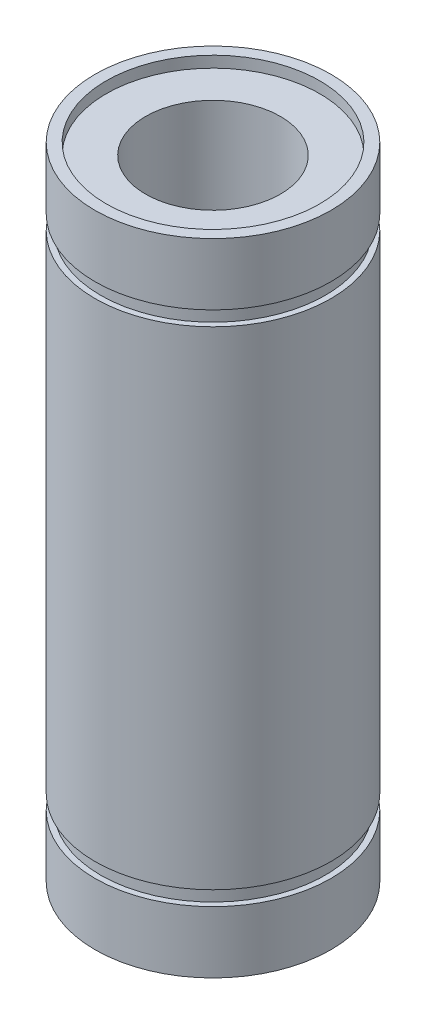
ISO-10303-21;
HEADER;
FILE_DESCRIPTION(('STEP AP214'),'2;1');
FILE_NAME('part.step','',(''),(''),'','','');
FILE_SCHEMA(('AUTOMOTIVE_DESIGN { 1 0 10303 214 1 1 1 1 }'));
ENDSEC;
DATA;
#1=APPLICATION_CONTEXT('core data for automotive mechanical design processes');
#2=APPLICATION_PROTOCOL_DEFINITION('international standard','automotive_design',2000,#1);
#3=PRODUCT_CONTEXT('',#1,'mechanical');
#4=PRODUCT('Part','Part','',(#3));
#5=PRODUCT_RELATED_PRODUCT_CATEGORY('part','',(#4));
#6=PRODUCT_DEFINITION_FORMATION('','',#4);
#7=PRODUCT_DEFINITION_CONTEXT('part definition',#1,'design');
#8=PRODUCT_DEFINITION('design','',#6,#7);
#9=PRODUCT_DEFINITION_SHAPE('','',#8);
#10=(LENGTH_UNIT() NAMED_UNIT(*) SI_UNIT(.MILLI.,.METRE.));
#11=(NAMED_UNIT(*) PLANE_ANGLE_UNIT() SI_UNIT($,.RADIAN.));
#12=(NAMED_UNIT(*) SI_UNIT($,.STERADIAN.) SOLID_ANGLE_UNIT());
#13=UNCERTAINTY_MEASURE_WITH_UNIT(LENGTH_MEASURE(1.E-05),#10,'distance_accuracy_value','');
#14=(GEOMETRIC_REPRESENTATION_CONTEXT(3) GLOBAL_UNCERTAINTY_ASSIGNED_CONTEXT((#13)) GLOBAL_UNIT_ASSIGNED_CONTEXT((#10,
#11,#12)) REPRESENTATION_CONTEXT('',''));
#15=CARTESIAN_POINT('',(0.,0.,0.));
#16=DIRECTION('',(0.,0.,1.));
#17=DIRECTION('',(1.,0.,0.));
#18=AXIS2_PLACEMENT_3D('',#15,#16,#17);
#19=CARTESIAN_POINT('',(0.,57.,0.));
#20=DIRECTION('',(0.,-1.,0.));
#21=DIRECTION('',(0.,0.,-1.));
#22=AXIS2_PLACEMENT_3D('',#19,#20,#21);
#23=CYLINDRICAL_SURFACE('',#22,10.5);
#24=CARTESIAN_POINT('',(0.,50.2,0.));
#25=DIRECTION('',(0.,1.,0.));
#26=DIRECTION('',(0.,0.,1.));
#27=AXIS2_PLACEMENT_3D('',#24,#25,#26);
#28=CIRCLE('',#27,10.5);
#29=CARTESIAN_POINT('',(0.,50.2,-10.5));
#30=VERTEX_POINT('',#29);
#31=EDGE_CURVE('E74',#30,#30,#28,.T.);
#32=CARTESIAN_POINT('',(0.,6.8,0.));
#33=DIRECTION('',(0.,-1.,0.));
#34=DIRECTION('',(0.,0.,-1.));
#35=AXIS2_PLACEMENT_3D('',#32,#33,#34);
#36=CIRCLE('',#35,10.5);
#37=CARTESIAN_POINT('',(0.,6.8,-10.5));
#38=VERTEX_POINT('',#37);
#39=EDGE_CURVE('E49',#38,#38,#36,.T.);
#40=CARTESIAN_POINT('',(0.,50.2,-10.5));
#41=CARTESIAN_POINT('',(0.,49.7479166666667,-10.5));
#42=CARTESIAN_POINT('',(0.,49.2958333333333,-10.5));
#43=CARTESIAN_POINT('',(0.,48.3916666666667,-10.5));
#44=CARTESIAN_POINT('',(0.,47.9395833333333,-10.5));
#45=CARTESIAN_POINT('',(0.,47.0354166666667,-10.5));
#46=CARTESIAN_POINT('',(0.,46.5833333333333,-10.5));
#47=CARTESIAN_POINT('',(0.,45.6791666666667,-10.5));
#48=CARTESIAN_POINT('',(0.,45.2270833333333,-10.5));
#49=CARTESIAN_POINT('',(0.,44.3229166666667,-10.5));
#50=CARTESIAN_POINT('',(0.,43.8708333333333,-10.5));
#51=CARTESIAN_POINT('',(0.,42.9666666666667,-10.5));
#52=CARTESIAN_POINT('',(0.,42.5145833333333,-10.5));
#53=CARTESIAN_POINT('',(0.,41.6104166666667,-10.5));
#54=CARTESIAN_POINT('',(0.,41.1583333333333,-10.5));
#55=CARTESIAN_POINT('',(0.,40.2541666666667,-10.5));
#56=CARTESIAN_POINT('',(0.,39.8020833333333,-10.5));
#57=CARTESIAN_POINT('',(0.,38.8979166666667,-10.5));
#58=CARTESIAN_POINT('',(0.,38.4458333333333,-10.5));
#59=CARTESIAN_POINT('',(0.,37.5416666666667,-10.5));
#60=CARTESIAN_POINT('',(0.,37.0895833333333,-10.5));
#61=CARTESIAN_POINT('',(0.,36.1854166666667,-10.5));
#62=CARTESIAN_POINT('',(0.,35.7333333333333,-10.5));
#63=CARTESIAN_POINT('',(0.,34.8291666666667,-10.5));
#64=CARTESIAN_POINT('',(0.,34.3770833333333,-10.5));
#65=CARTESIAN_POINT('',(0.,33.4729166666667,-10.5));
#66=CARTESIAN_POINT('',(0.,33.0208333333333,-10.5));
#67=CARTESIAN_POINT('',(0.,32.1166666666667,-10.5));
#68=CARTESIAN_POINT('',(0.,31.6645833333333,-10.5));
#69=CARTESIAN_POINT('',(0.,30.7604166666667,-10.5));
#70=CARTESIAN_POINT('',(0.,30.3083333333333,-10.5));
#71=CARTESIAN_POINT('',(0.,29.4041666666667,-10.5));
#72=CARTESIAN_POINT('',(0.,28.9520833333333,-10.5));
#73=CARTESIAN_POINT('',(0.,28.0479166666667,-10.5));
#74=CARTESIAN_POINT('',(0.,27.5958333333333,-10.5));
#75=CARTESIAN_POINT('',(0.,26.6916666666667,-10.5));
#76=CARTESIAN_POINT('',(0.,26.2395833333333,-10.5));
#77=CARTESIAN_POINT('',(0.,25.3354166666667,-10.5));
#78=CARTESIAN_POINT('',(0.,24.8833333333333,-10.5));
#79=CARTESIAN_POINT('',(0.,23.9791666666667,-10.5));
#80=CARTESIAN_POINT('',(0.,23.5270833333333,-10.5));
#81=CARTESIAN_POINT('',(0.,22.6229166666667,-10.5));
#82=CARTESIAN_POINT('',(0.,22.1708333333333,-10.5));
#83=CARTESIAN_POINT('',(0.,21.2666666666667,-10.5));
#84=CARTESIAN_POINT('',(0.,20.8145833333333,-10.5));
#85=CARTESIAN_POINT('',(0.,19.9104166666667,-10.5));
#86=CARTESIAN_POINT('',(0.,19.4583333333333,-10.5));
#87=CARTESIAN_POINT('',(0.,18.5541666666667,-10.5));
#88=CARTESIAN_POINT('',(0.,18.1020833333333,-10.5));
#89=CARTESIAN_POINT('',(0.,17.1979166666667,-10.5));
#90=CARTESIAN_POINT('',(0.,16.7458333333333,-10.5));
#91=CARTESIAN_POINT('',(0.,15.8416666666667,-10.5));
#92=CARTESIAN_POINT('',(0.,15.3895833333333,-10.5));
#93=CARTESIAN_POINT('',(0.,14.4854166666667,-10.5));
#94=CARTESIAN_POINT('',(0.,14.0333333333333,-10.5));
#95=CARTESIAN_POINT('',(0.,13.1291666666667,-10.5));
#96=CARTESIAN_POINT('',(0.,12.6770833333333,-10.5));
#97=CARTESIAN_POINT('',(0.,11.7729166666667,-10.5));
#98=CARTESIAN_POINT('',(0.,11.3208333333333,-10.5));
#99=CARTESIAN_POINT('',(0.,10.4166666666667,-10.5));
#100=CARTESIAN_POINT('',(0.,9.96458333333333,-10.5));
#101=CARTESIAN_POINT('',(0.,9.06041666666666,-10.5));
#102=CARTESIAN_POINT('',(0.,8.60833333333333,-10.5));
#103=CARTESIAN_POINT('',(0.,7.70416666666667,-10.5));
#104=CARTESIAN_POINT('',(0.,7.25208333333333,-10.5));
#105=CARTESIAN_POINT('',(0.,6.8,-10.5));
#106=B_SPLINE_CURVE_WITH_KNOTS('',3,(#40,#41,#42,#43,#44,#45,#46,#47,#48,#49,#50,#51,#52,#53,
#54,#55,#56,#57,#58,#59,#60,#61,#62,#63,#64,#65,#66,#67,#68,#69,#70,#71,#72,#73,#74,#75,#76,#77,
#78,#79,#80,#81,#82,#83,#84,#85,#86,#87,#88,#89,#90,#91,#92,#93,#94,#95,#96,#97,#98,#99,#100,
#101,#102,#103,#104,#105),.UNSPECIFIED.,.F.,.F.,(4,2,2,2,2,2,2,2,2,2,2,2,2,2,2,2,2,2,2,2,2,2,2,
2,2,2,2,2,2,2,2,2,4),(0.,1.35625,2.7125,4.06875,5.42500000000001,6.78125,8.13750000000001,
9.49375,10.85,12.20625,13.5625,14.91875,16.275,17.63125,18.9875,20.34375,21.7,23.05625,24.4125,
25.76875,27.125,28.48125,29.8375,31.19375,32.55,33.90625,35.2625,36.61875,37.975,39.33125,
40.6875,42.04375,43.4),.UNSPECIFIED.);
#107=EDGE_CURVE('BSEAM45',#30,#38,#106,.T.);
#108=ORIENTED_EDGE('',*,*,#31,.F.);
#109=ORIENTED_EDGE('',*,*,#39,.F.);
#110=ORIENTED_EDGE('',*,*,#107,.T.);
#111=ORIENTED_EDGE('',*,*,#107,.F.);
#112=EDGE_LOOP('',(#108,#110,#109,#111));
#113=FACE_BOUND('',#112,.T.);
#114=ADVANCED_FACE('F45',(#113),#23,.T.);
#115=CARTESIAN_POINT('',(0.,5.5,0.));
#116=DIRECTION('',(0.,-1.,0.));
#117=DIRECTION('',(0.,0.,-1.));
#118=AXIS2_PLACEMENT_3D('',#115,#116,#117);
#119=CIRCLE('',#118,10.5);
#120=CARTESIAN_POINT('',(0.,5.50000000000001,-10.5));
#121=VERTEX_POINT('',#120);
#122=EDGE_CURVE('E78',#121,#121,#119,.T.);
#123=CARTESIAN_POINT('',(0.,0.,0.));
#124=DIRECTION('',(0.,1.,0.));
#125=DIRECTION('',(0.,0.,1.));
#126=AXIS2_PLACEMENT_3D('',#123,#124,#125);
#127=CIRCLE('',#126,10.5);
#128=CARTESIAN_POINT('',(0.,0.,-10.5));
#129=VERTEX_POINT('',#128);
#130=EDGE_CURVE('E53',#129,#129,#127,.T.);
#131=CARTESIAN_POINT('',(0.,5.50000000000001,-10.5));
#132=CARTESIAN_POINT('',(0.,5.44270833333334,-10.5));
#133=CARTESIAN_POINT('',(0.,5.38541666666667,-10.5));
#134=CARTESIAN_POINT('',(0.,5.27083333333334,-10.5));
#135=CARTESIAN_POINT('',(0.,5.21354166666667,-10.5));
#136=CARTESIAN_POINT('',(0.,5.09895833333334,-10.5));
#137=CARTESIAN_POINT('',(0.,5.04166666666667,-10.5));
#138=CARTESIAN_POINT('',(0.,4.92708333333334,-10.5));
#139=CARTESIAN_POINT('',(0.,4.86979166666667,-10.5));
#140=CARTESIAN_POINT('',(0.,4.75520833333334,-10.5));
#141=CARTESIAN_POINT('',(0.,4.69791666666667,-10.5));
#142=CARTESIAN_POINT('',(0.,4.58333333333334,-10.5));
#143=CARTESIAN_POINT('',(0.,4.52604166666667,-10.5));
#144=CARTESIAN_POINT('',(0.,4.41145833333334,-10.5));
#145=CARTESIAN_POINT('',(0.,4.35416666666667,-10.5));
#146=CARTESIAN_POINT('',(0.,4.23958333333334,-10.5));
#147=CARTESIAN_POINT('',(0.,4.18229166666667,-10.5));
#148=CARTESIAN_POINT('',(0.,4.06770833333334,-10.5));
#149=CARTESIAN_POINT('',(0.,4.01041666666667,-10.5));
#150=CARTESIAN_POINT('',(0.,3.89583333333333,-10.5));
#151=CARTESIAN_POINT('',(0.,3.83854166666667,-10.5));
#152=CARTESIAN_POINT('',(0.,3.72395833333333,-10.5));
#153=CARTESIAN_POINT('',(0.,3.66666666666667,-10.5));
#154=CARTESIAN_POINT('',(0.,3.55208333333334,-10.5));
#155=CARTESIAN_POINT('',(0.,3.49479166666667,-10.5));
#156=CARTESIAN_POINT('',(0.,3.38020833333334,-10.5));
#157=CARTESIAN_POINT('',(0.,3.32291666666667,-10.5));
#158=CARTESIAN_POINT('',(0.,3.20833333333334,-10.5));
#159=CARTESIAN_POINT('',(0.,3.15104166666667,-10.5));
#160=CARTESIAN_POINT('',(0.,3.03645833333334,-10.5));
#161=CARTESIAN_POINT('',(0.,2.97916666666667,-10.5));
#162=CARTESIAN_POINT('',(0.,2.86458333333334,-10.5));
#163=CARTESIAN_POINT('',(0.,2.80729166666667,-10.5));
#164=CARTESIAN_POINT('',(0.,2.69270833333334,-10.5));
#165=CARTESIAN_POINT('',(0.,2.63541666666667,-10.5));
#166=CARTESIAN_POINT('',(0.,2.52083333333333,-10.5));
#167=CARTESIAN_POINT('',(0.,2.46354166666667,-10.5));
#168=CARTESIAN_POINT('',(0.,2.34895833333333,-10.5));
#169=CARTESIAN_POINT('',(0.,2.29166666666667,-10.5));
#170=CARTESIAN_POINT('',(0.,2.17708333333334,-10.5));
#171=CARTESIAN_POINT('',(0.,2.11979166666667,-10.5));
#172=CARTESIAN_POINT('',(0.,2.00520833333333,-10.5));
#173=CARTESIAN_POINT('',(0.,1.94791666666667,-10.5));
#174=CARTESIAN_POINT('',(0.,1.83333333333334,-10.5));
#175=CARTESIAN_POINT('',(0.,1.77604166666667,-10.5));
#176=CARTESIAN_POINT('',(0.,1.66145833333334,-10.5));
#177=CARTESIAN_POINT('',(0.,1.60416666666667,-10.5));
#178=CARTESIAN_POINT('',(0.,1.48958333333334,-10.5));
#179=CARTESIAN_POINT('',(0.,1.43229166666667,-10.5));
#180=CARTESIAN_POINT('',(0.,1.31770833333333,-10.5));
#181=CARTESIAN_POINT('',(0.,1.26041666666667,-10.5));
#182=CARTESIAN_POINT('',(0.,1.14583333333333,-10.5));
#183=CARTESIAN_POINT('',(0.,1.08854166666666,-10.5));
#184=CARTESIAN_POINT('',(0.,0.973958333333332,-10.5));
#185=CARTESIAN_POINT('',(0.,0.916666666666668,-10.5));
#186=CARTESIAN_POINT('',(0.,0.802083333333335,-10.5));
#187=CARTESIAN_POINT('',(0.,0.744791666666668,-10.5));
#188=CARTESIAN_POINT('',(0.,0.630208333333333,-10.5));
#189=CARTESIAN_POINT('',(0.,0.572916666666666,-10.5));
#190=CARTESIAN_POINT('',(0.,0.458333333333334,-10.5));
#191=CARTESIAN_POINT('',(0.,0.401041666666669,-10.5));
#192=CARTESIAN_POINT('',(0.,0.286458333333336,-10.5));
#193=CARTESIAN_POINT('',(0.,0.229166666666669,-10.5));
#194=CARTESIAN_POINT('',(0.,0.114583333333335,-10.5));
#195=CARTESIAN_POINT('',(0.,0.0572916666666673,-10.5));
#196=CARTESIAN_POINT('',(0.,0.,-10.5));
#197=B_SPLINE_CURVE_WITH_KNOTS('',3,(#131,#132,#133,#134,#135,#136,#137,#138,#139,#140,#141,
#142,#143,#144,#145,#146,#147,#148,#149,#150,#151,#152,#153,#154,#155,#156,#157,#158,#159,#160,
#161,#162,#163,#164,#165,#166,#167,#168,#169,#170,#171,#172,#173,#174,#175,#176,#177,#178,#179,
#180,#181,#182,#183,#184,#185,#186,#187,#188,#189,#190,#191,#192,#193,#194,#195,#196),
.UNSPECIFIED.,.F.,.F.,(4,2,2,2,2,2,2,2,2,2,2,2,2,2,2,2,2,2,2,2,2,2,2,2,2,2,2,2,2,2,2,2,4),(0.,
0.171875000000002,0.343750000000004,0.515624999999999,0.687500000000001,0.859375000000002,
1.03125,1.203125,1.375,1.546875,1.71875,1.890625,2.0625,2.234375,2.40625,2.578125,2.75,2.921875,
3.09375000000001,3.265625,3.4375,3.609375,3.78125,3.953125,4.125,4.29687500000001,
4.46875000000001,4.640625,4.8125,4.98437500000001,5.15625,5.328125,5.50000000000001),.UNSPECIFIED.);
#198=EDGE_CURVE('BSEAM119',#121,#129,#197,.T.);
#199=ORIENTED_EDGE('',*,*,#122,.T.);
#200=ORIENTED_EDGE('',*,*,#130,.T.);
#201=ORIENTED_EDGE('',*,*,#198,.T.);
#202=ORIENTED_EDGE('',*,*,#198,.F.);
#203=EDGE_LOOP('',(#199,#201,#200,#202));
#204=FACE_BOUND('',#203,.T.);
#205=ADVANCED_FACE('F119',(#204),#23,.T.);
#206=CARTESIAN_POINT('',(0.,57.,0.));
#207=DIRECTION('',(0.,-1.,0.));
#208=DIRECTION('',(0.,0.,-1.));
#209=AXIS2_PLACEMENT_3D('',#206,#207,#208);
#210=CYLINDRICAL_SURFACE('',#209,6.);
#211=CARTESIAN_POINT('',(0.,56.,0.));
#212=DIRECTION('',(0.,1.,0.));
#213=DIRECTION('',(0.,0.,1.));
#214=AXIS2_PLACEMENT_3D('',#211,#212,#213);
#215=CIRCLE('',#214,6.);
#216=CARTESIAN_POINT('',(0.,56.,-6.));
#217=VERTEX_POINT('',#216);
#218=EDGE_CURVE('E58',#217,#217,#215,.T.);
#219=CARTESIAN_POINT('',(0.,1.,0.));
#220=DIRECTION('',(0.,-1.,0.));
#221=DIRECTION('',(0.,0.,-1.));
#222=AXIS2_PLACEMENT_3D('',#219,#220,#221);
#223=CIRCLE('',#222,6.);
#224=CARTESIAN_POINT('',(0.,1.,-6.));
#225=VERTEX_POINT('',#224);
#226=EDGE_CURVE('E67',#225,#225,#223,.T.);
#227=CARTESIAN_POINT('',(0.,56.,-6.));
#228=CARTESIAN_POINT('',(0.,55.4270833333333,-6.));
#229=CARTESIAN_POINT('',(0.,54.8541666666667,-6.));
#230=CARTESIAN_POINT('',(0.,53.7083333333333,-6.));
#231=CARTESIAN_POINT('',(0.,53.1354166666667,-6.));
#232=CARTESIAN_POINT('',(0.,51.9895833333333,-6.));
#233=CARTESIAN_POINT('',(0.,51.4166666666667,-6.));
#234=CARTESIAN_POINT('',(0.,50.2708333333333,-6.));
#235=CARTESIAN_POINT('',(0.,49.6979166666667,-6.));
#236=CARTESIAN_POINT('',(0.,48.5520833333333,-6.));
#237=CARTESIAN_POINT('',(0.,47.9791666666667,-6.));
#238=CARTESIAN_POINT('',(0.,46.8333333333333,-6.));
#239=CARTESIAN_POINT('',(0.,46.2604166666667,-6.));
#240=CARTESIAN_POINT('',(0.,45.1145833333333,-6.));
#241=CARTESIAN_POINT('',(0.,44.5416666666667,-6.));
#242=CARTESIAN_POINT('',(0.,43.3958333333333,-6.));
#243=CARTESIAN_POINT('',(0.,42.8229166666667,-6.));
#244=CARTESIAN_POINT('',(0.,41.6770833333333,-6.));
#245=CARTESIAN_POINT('',(0.,41.1041666666667,-6.));
#246=CARTESIAN_POINT('',(0.,39.9583333333333,-6.));
#247=CARTESIAN_POINT('',(0.,39.3854166666667,-6.));
#248=CARTESIAN_POINT('',(0.,38.2395833333333,-6.));
#249=CARTESIAN_POINT('',(0.,37.6666666666667,-6.));
#250=CARTESIAN_POINT('',(0.,36.5208333333333,-6.));
#251=CARTESIAN_POINT('',(0.,35.9479166666667,-6.));
#252=CARTESIAN_POINT('',(0.,34.8020833333333,-6.));
#253=CARTESIAN_POINT('',(0.,34.2291666666667,-6.));
#254=CARTESIAN_POINT('',(0.,33.0833333333333,-6.));
#255=CARTESIAN_POINT('',(0.,32.5104166666667,-6.));
#256=CARTESIAN_POINT('',(0.,31.3645833333333,-6.));
#257=CARTESIAN_POINT('',(0.,30.7916666666667,-6.));
#258=CARTESIAN_POINT('',(0.,29.6458333333333,-6.));
#259=CARTESIAN_POINT('',(0.,29.0729166666667,-6.));
#260=CARTESIAN_POINT('',(0.,27.9270833333333,-6.));
#261=CARTESIAN_POINT('',(0.,27.3541666666667,-6.));
#262=CARTESIAN_POINT('',(0.,26.2083333333333,-6.));
#263=CARTESIAN_POINT('',(0.,25.6354166666667,-6.));
#264=CARTESIAN_POINT('',(0.,24.4895833333333,-6.));
#265=CARTESIAN_POINT('',(0.,23.9166666666667,-6.));
#266=CARTESIAN_POINT('',(0.,22.7708333333333,-6.));
#267=CARTESIAN_POINT('',(0.,22.1979166666667,-6.));
#268=CARTESIAN_POINT('',(0.,21.0520833333333,-6.));
#269=CARTESIAN_POINT('',(0.,20.4791666666667,-6.));
#270=CARTESIAN_POINT('',(0.,19.3333333333333,-6.));
#271=CARTESIAN_POINT('',(0.,18.7604166666667,-6.));
#272=CARTESIAN_POINT('',(0.,17.6145833333333,-6.));
#273=CARTESIAN_POINT('',(0.,17.0416666666667,-6.));
#274=CARTESIAN_POINT('',(0.,15.8958333333333,-6.));
#275=CARTESIAN_POINT('',(0.,15.3229166666667,-6.));
#276=CARTESIAN_POINT('',(0.,14.1770833333333,-6.));
#277=CARTESIAN_POINT('',(0.,13.6041666666667,-6.));
#278=CARTESIAN_POINT('',(0.,12.4583333333333,-6.));
#279=CARTESIAN_POINT('',(0.,11.8854166666667,-6.));
#280=CARTESIAN_POINT('',(0.,10.7395833333333,-6.));
#281=CARTESIAN_POINT('',(0.,10.1666666666667,-6.));
#282=CARTESIAN_POINT('',(0.,9.02083333333333,-6.));
#283=CARTESIAN_POINT('',(0.,8.44791666666666,-6.));
#284=CARTESIAN_POINT('',(0.,7.30208333333333,-6.));
#285=CARTESIAN_POINT('',(0.,6.72916666666667,-6.));
#286=CARTESIAN_POINT('',(0.,5.58333333333333,-6.));
#287=CARTESIAN_POINT('',(0.,5.01041666666667,-6.));
#288=CARTESIAN_POINT('',(0.,3.86458333333333,-6.));
#289=CARTESIAN_POINT('',(0.,3.29166666666666,-6.));
#290=CARTESIAN_POINT('',(0.,2.14583333333333,-6.));
#291=CARTESIAN_POINT('',(0.,1.57291666666666,-6.));
#292=CARTESIAN_POINT('',(0.,1.,-6.));
#293=B_SPLINE_CURVE_WITH_KNOTS('',3,(#227,#228,#229,#230,#231,#232,#233,#234,#235,#236,#237,
#238,#239,#240,#241,#242,#243,#244,#245,#246,#247,#248,#249,#250,#251,#252,#253,#254,#255,#256,
#257,#258,#259,#260,#261,#262,#263,#264,#265,#266,#267,#268,#269,#270,#271,#272,#273,#274,#275,
#276,#277,#278,#279,#280,#281,#282,#283,#284,#285,#286,#287,#288,#289,#290,#291,#292),
.UNSPECIFIED.,.F.,.F.,(4,2,2,2,2,2,2,2,2,2,2,2,2,2,2,2,2,2,2,2,2,2,2,2,2,2,2,2,2,2,2,2,4),(0.,
1.71875,3.4375,5.15625,6.875,8.59375,10.3125,12.03125,13.75,15.46875,17.1875,18.90625,20.625,
22.34375,24.0625,25.78125,27.5,29.21875,30.9375,32.65625,34.375,36.09375,37.8125,39.53125,41.25,
42.96875,44.6875,46.40625,48.125,49.84375,51.5625,53.28125,55.),.UNSPECIFIED.);
#294=EDGE_CURVE('BSEAM111',#217,#225,#293,.T.);
#295=ORIENTED_EDGE('',*,*,#218,.T.);
#296=ORIENTED_EDGE('',*,*,#226,.T.);
#297=ORIENTED_EDGE('',*,*,#294,.T.);
#298=ORIENTED_EDGE('',*,*,#294,.F.);
#299=EDGE_LOOP('',(#295,#297,#296,#298));
#300=FACE_BOUND('',#299,.T.);
#301=ADVANCED_FACE('F111',(#300),#210,.F.);
#302=CARTESIAN_POINT('',(0.,57.,0.));
#303=DIRECTION('',(0.,1.,0.));
#304=DIRECTION('',(0.,0.,1.));
#305=AXIS2_PLACEMENT_3D('',#302,#303,#304);
#306=PLANE('',#305);
#307=CARTESIAN_POINT('',(0.,57.,0.));
#308=DIRECTION('',(0.,1.,0.));
#309=DIRECTION('',(0.,0.,1.));
#310=AXIS2_PLACEMENT_3D('',#307,#308,#309);
#311=CIRCLE('',#310,9.5);
#312=CARTESIAN_POINT('',(0.,57.,9.5));
#313=VERTEX_POINT('',#312);
#314=EDGE_CURVE('E61',#313,#313,#311,.T.);
#315=ORIENTED_EDGE('',*,*,#314,.F.);
#316=EDGE_LOOP('',(#315));
#317=FACE_BOUND('',#316,.T.);
#318=CARTESIAN_POINT('',(0.,57.,0.));
#319=DIRECTION('',(0.,1.,0.));
#320=DIRECTION('',(0.,0.,1.));
#321=AXIS2_PLACEMENT_3D('',#318,#319,#320);
#322=CIRCLE('',#321,10.5);
#323=CARTESIAN_POINT('',(0.,57.,-10.5));
#324=VERTEX_POINT('',#323);
#325=EDGE_CURVE('E11',#324,#324,#322,.T.);
#326=ORIENTED_EDGE('',*,*,#325,.T.);
#327=EDGE_LOOP('',(#326));
#328=FACE_BOUND('',#327,.T.);
#329=ADVANCED_FACE('F108',(#317,#328),#306,.T.);
#330=CARTESIAN_POINT('',(0.,0.,0.));
#331=DIRECTION('',(0.,1.,0.));
#332=DIRECTION('',(0.,0.,1.));
#333=AXIS2_PLACEMENT_3D('',#330,#331,#332);
#334=PLANE('',#333);
#335=CARTESIAN_POINT('',(0.,0.,0.));
#336=DIRECTION('',(0.,-1.,0.));
#337=DIRECTION('',(0.,0.,-1.));
#338=AXIS2_PLACEMENT_3D('',#335,#336,#337);
#339=CIRCLE('',#338,9.5);
#340=CARTESIAN_POINT('',(0.,0.,-9.5));
#341=VERTEX_POINT('',#340);
#342=EDGE_CURVE('E77',#341,#341,#339,.T.);
#343=ORIENTED_EDGE('',*,*,#342,.F.);
#344=EDGE_LOOP('',(#343));
#345=FACE_BOUND('',#344,.T.);
#346=ORIENTED_EDGE('',*,*,#130,.F.);
#347=EDGE_LOOP('',(#346));
#348=FACE_BOUND('',#347,.T.);
#349=ADVANCED_FACE('F110',(#345,#348),#334,.F.);
#350=CARTESIAN_POINT('',(0.,51.5,0.));
#351=DIRECTION('',(0.,1.,0.));
#352=DIRECTION('',(0.,0.,1.));
#353=AXIS2_PLACEMENT_3D('',#350,#351,#352);
#354=CIRCLE('',#353,10.5);
#355=CARTESIAN_POINT('',(0.,51.5,-10.5));
#356=VERTEX_POINT('',#355);
#357=EDGE_CURVE('E71',#356,#356,#354,.T.);
#358=CARTESIAN_POINT('',(0.,51.5,-10.5));
#359=CARTESIAN_POINT('',(0.,51.5572916666667,-10.5));
#360=CARTESIAN_POINT('',(0.,51.6145833333333,-10.5));
#361=CARTESIAN_POINT('',(0.,51.7291666666667,-10.5));
#362=CARTESIAN_POINT('',(0.,51.7864583333333,-10.5));
#363=CARTESIAN_POINT('',(0.,51.9010416666667,-10.5));
#364=CARTESIAN_POINT('',(0.,51.9583333333333,-10.5));
#365=CARTESIAN_POINT('',(0.,52.0729166666667,-10.5));
#366=CARTESIAN_POINT('',(0.,52.1302083333333,-10.5));
#367=CARTESIAN_POINT('',(0.,52.2447916666667,-10.5));
#368=CARTESIAN_POINT('',(0.,52.3020833333333,-10.5));
#369=CARTESIAN_POINT('',(0.,52.4166666666667,-10.5));
#370=CARTESIAN_POINT('',(0.,52.4739583333333,-10.5));
#371=CARTESIAN_POINT('',(0.,52.5885416666667,-10.5));
#372=CARTESIAN_POINT('',(0.,52.6458333333333,-10.5));
#373=CARTESIAN_POINT('',(0.,52.7604166666667,-10.5));
#374=CARTESIAN_POINT('',(0.,52.8177083333333,-10.5));
#375=CARTESIAN_POINT('',(0.,52.9322916666667,-10.5));
#376=CARTESIAN_POINT('',(0.,52.9895833333333,-10.5));
#377=CARTESIAN_POINT('',(0.,53.1041666666667,-10.5));
#378=CARTESIAN_POINT('',(0.,53.1614583333333,-10.5));
#379=CARTESIAN_POINT('',(0.,53.2760416666667,-10.5));
#380=CARTESIAN_POINT('',(0.,53.3333333333333,-10.5));
#381=CARTESIAN_POINT('',(0.,53.4479166666667,-10.5));
#382=CARTESIAN_POINT('',(0.,53.5052083333333,-10.5));
#383=CARTESIAN_POINT('',(0.,53.6197916666667,-10.5));
#384=CARTESIAN_POINT('',(0.,53.6770833333333,-10.5));
#385=CARTESIAN_POINT('',(0.,53.7916666666667,-10.5));
#386=CARTESIAN_POINT('',(0.,53.8489583333333,-10.5));
#387=CARTESIAN_POINT('',(0.,53.9635416666667,-10.5));
#388=CARTESIAN_POINT('',(0.,54.0208333333333,-10.5));
#389=CARTESIAN_POINT('',(0.,54.1354166666667,-10.5));
#390=CARTESIAN_POINT('',(0.,54.1927083333333,-10.5));
#391=CARTESIAN_POINT('',(0.,54.3072916666667,-10.5));
#392=CARTESIAN_POINT('',(0.,54.3645833333333,-10.5));
#393=CARTESIAN_POINT('',(0.,54.4791666666667,-10.5));
#394=CARTESIAN_POINT('',(0.,54.5364583333333,-10.5));
#395=CARTESIAN_POINT('',(0.,54.6510416666667,-10.5));
#396=CARTESIAN_POINT('',(0.,54.7083333333333,-10.5));
#397=CARTESIAN_POINT('',(0.,54.8229166666667,-10.5));
#398=CARTESIAN_POINT('',(0.,54.8802083333333,-10.5));
#399=CARTESIAN_POINT('',(0.,54.9947916666667,-10.5));
#400=CARTESIAN_POINT('',(0.,55.0520833333333,-10.5));
#401=CARTESIAN_POINT('',(0.,55.1666666666667,-10.5));
#402=CARTESIAN_POINT('',(0.,55.2239583333333,-10.5));
#403=CARTESIAN_POINT('',(0.,55.3385416666667,-10.5));
#404=CARTESIAN_POINT('',(0.,55.3958333333333,-10.5));
#405=CARTESIAN_POINT('',(0.,55.5104166666667,-10.5));
#406=CARTESIAN_POINT('',(0.,55.5677083333333,-10.5));
#407=CARTESIAN_POINT('',(0.,55.6822916666667,-10.5));
#408=CARTESIAN_POINT('',(0.,55.7395833333333,-10.5));
#409=CARTESIAN_POINT('',(0.,55.8541666666667,-10.5));
#410=CARTESIAN_POINT('',(0.,55.9114583333333,-10.5));
#411=CARTESIAN_POINT('',(0.,56.0260416666667,-10.5));
#412=CARTESIAN_POINT('',(0.,56.0833333333333,-10.5));
#413=CARTESIAN_POINT('',(0.,56.1979166666667,-10.5));
#414=CARTESIAN_POINT('',(0.,56.2552083333333,-10.5));
#415=CARTESIAN_POINT('',(0.,56.3697916666667,-10.5));
#416=CARTESIAN_POINT('',(0.,56.4270833333333,-10.5));
#417=CARTESIAN_POINT('',(0.,56.5416666666667,-10.5));
#418=CARTESIAN_POINT('',(0.,56.5989583333333,-10.5));
#419=CARTESIAN_POINT('',(0.,56.7135416666667,-10.5));
#420=CARTESIAN_POINT('',(0.,56.7708333333333,-10.5));
#421=CARTESIAN_POINT('',(0.,56.8854166666667,-10.5));
#422=CARTESIAN_POINT('',(0.,56.9427083333333,-10.5));
#423=CARTESIAN_POINT('',(0.,57.,-10.5));
#424=B_SPLINE_CURVE_WITH_KNOTS('',3,(#358,#359,#360,#361,#362,#363,#364,#365,#366,#367,#368,
#369,#370,#371,#372,#373,#374,#375,#376,#377,#378,#379,#380,#381,#382,#383,#384,#385,#386,#387,
#388,#389,#390,#391,#392,#393,#394,#395,#396,#397,#398,#399,#400,#401,#402,#403,#404,#405,#406,
#407,#408,#409,#410,#411,#412,#413,#414,#415,#416,#417,#418,#419,#420,#421,#422,#423),
.UNSPECIFIED.,.F.,.F.,(4,2,2,2,2,2,2,2,2,2,2,2,2,2,2,2,2,2,2,2,2,2,2,2,2,2,2,2,2,2,2,2,4),(0.,
0.171875000000002,0.343750000000004,0.515625000000006,0.687500000000001,0.859375000000002,
1.03125,1.20312500000001,1.375,1.546875,1.71875,1.890625,2.0625,2.234375,2.40625000000001,
2.578125,2.75,2.921875,3.09375,3.265625,3.4375,3.609375,3.78125,3.953125,4.125,4.296875,4.46875,
4.640625,4.8125,4.984375,5.15625,5.328125,5.50000000000001),.UNSPECIFIED.);
#425=EDGE_CURVE('BSEAM47',#356,#324,#424,.T.);
#426=ORIENTED_EDGE('',*,*,#357,.T.);
#427=ORIENTED_EDGE('',*,*,#325,.F.);
#428=ORIENTED_EDGE('',*,*,#425,.T.);
#429=ORIENTED_EDGE('',*,*,#425,.F.);
#430=EDGE_LOOP('',(#426,#428,#427,#429));
#431=FACE_BOUND('',#430,.T.);
#432=ADVANCED_FACE('F47',(#431),#23,.T.);
#433=CARTESIAN_POINT('',(0.,56.,0.));
#434=DIRECTION('',(0.,1.,0.));
#435=DIRECTION('',(0.,0.,1.));
#436=AXIS2_PLACEMENT_3D('',#433,#434,#435);
#437=CYLINDRICAL_SURFACE('',#436,9.5);
#438=CARTESIAN_POINT('',(0.,56.,0.));
#439=DIRECTION('',(0.,1.,0.));
#440=DIRECTION('',(0.,0.,1.));
#441=AXIS2_PLACEMENT_3D('',#438,#439,#440);
#442=CIRCLE('',#441,9.5);
#443=CARTESIAN_POINT('',(0.,56.,9.5));
#444=VERTEX_POINT('',#443);
#445=EDGE_CURVE('E66',#444,#444,#442,.T.);
#446=ORIENTED_EDGE('',*,*,#445,.F.);
#447=EDGE_LOOP('',(#446));
#448=FACE_BOUND('',#447,.T.);
#449=ORIENTED_EDGE('',*,*,#314,.T.);
#450=EDGE_LOOP('',(#449));
#451=FACE_BOUND('',#450,.T.);
#452=ADVANCED_FACE('F106',(#448,#451),#437,.F.);
#453=CARTESIAN_POINT('',(0.,56.,0.));
#454=DIRECTION('',(0.,1.,0.));
#455=DIRECTION('',(0.,0.,1.));
#456=AXIS2_PLACEMENT_3D('',#453,#454,#455);
#457=PLANE('',#456);
#458=ORIENTED_EDGE('',*,*,#218,.F.);
#459=EDGE_LOOP('',(#458));
#460=FACE_BOUND('',#459,.T.);
#461=ORIENTED_EDGE('',*,*,#445,.T.);
#462=EDGE_LOOP('',(#461));
#463=FACE_BOUND('',#462,.T.);
#464=ADVANCED_FACE('F137',(#460,#463),#457,.T.);
#465=CARTESIAN_POINT('',(0.,1.,0.));
#466=DIRECTION('',(0.,-1.,0.));
#467=DIRECTION('',(0.,0.,-1.));
#468=AXIS2_PLACEMENT_3D('',#465,#466,#467);
#469=CYLINDRICAL_SURFACE('',#468,9.5);
#470=CARTESIAN_POINT('',(0.,1.,0.));
#471=DIRECTION('',(0.,-1.,0.));
#472=DIRECTION('',(0.,0.,-1.));
#473=AXIS2_PLACEMENT_3D('',#470,#471,#472);
#474=CIRCLE('',#473,9.5);
#475=CARTESIAN_POINT('',(0.,1.,-9.5));
#476=VERTEX_POINT('',#475);
#477=EDGE_CURVE('E70',#476,#476,#474,.T.);
#478=ORIENTED_EDGE('',*,*,#477,.F.);
#479=EDGE_LOOP('',(#478));
#480=FACE_BOUND('',#479,.T.);
#481=ORIENTED_EDGE('',*,*,#342,.T.);
#482=EDGE_LOOP('',(#481));
#483=FACE_BOUND('',#482,.T.);
#484=ADVANCED_FACE('F162',(#480,#483),#469,.F.);
#485=CARTESIAN_POINT('',(0.,1.,0.));
#486=DIRECTION('',(0.,-1.,0.));
#487=DIRECTION('',(0.,0.,-1.));
#488=AXIS2_PLACEMENT_3D('',#485,#486,#487);
#489=PLANE('',#488);
#490=ORIENTED_EDGE('',*,*,#226,.F.);
#491=EDGE_LOOP('',(#490));
#492=FACE_BOUND('',#491,.T.);
#493=ORIENTED_EDGE('',*,*,#477,.T.);
#494=EDGE_LOOP('',(#493));
#495=FACE_BOUND('',#494,.T.);
#496=ADVANCED_FACE('F156',(#492,#495),#489,.T.);
#497=CARTESIAN_POINT('',(0.,50.2,0.));
#498=DIRECTION('',(0.,1.,0.));
#499=DIRECTION('',(0.,0.,1.));
#500=AXIS2_PLACEMENT_3D('',#497,#498,#499);
#501=PLANE('',#500);
#502=CARTESIAN_POINT('',(0.,50.2,0.));
#503=DIRECTION('',(0.,1.,0.));
#504=DIRECTION('',(0.,0.,1.));
#505=AXIS2_PLACEMENT_3D('',#502,#503,#504);
#506=CIRCLE('',#505,10.);
#507=CARTESIAN_POINT('',(0.,50.2,10.));
#508=VERTEX_POINT('',#507);
#509=EDGE_CURVE('E75',#508,#508,#506,.T.);
#510=ORIENTED_EDGE('',*,*,#509,.F.);
#511=EDGE_LOOP('',(#510));
#512=FACE_BOUND('',#511,.T.);
#513=ORIENTED_EDGE('',*,*,#31,.T.);
#514=EDGE_LOOP('',(#513));
#515=FACE_BOUND('',#514,.T.);
#516=ADVANCED_FACE('F146',(#512,#515),#501,.T.);
#517=CARTESIAN_POINT('',(0.,51.5,0.));
#518=DIRECTION('',(0.,1.,0.));
#519=DIRECTION('',(0.,0.,1.));
#520=AXIS2_PLACEMENT_3D('',#517,#518,#519);
#521=PLANE('',#520);
#522=CARTESIAN_POINT('',(0.,51.5,0.));
#523=DIRECTION('',(0.,1.,0.));
#524=DIRECTION('',(0.,0.,1.));
#525=AXIS2_PLACEMENT_3D('',#522,#523,#524);
#526=CIRCLE('',#525,10.);
#527=CARTESIAN_POINT('',(0.,51.5,10.));
#528=VERTEX_POINT('',#527);
#529=EDGE_CURVE('E84',#528,#528,#526,.T.);
#530=ORIENTED_EDGE('',*,*,#529,.T.);
#531=EDGE_LOOP('',(#530));
#532=FACE_BOUND('',#531,.T.);
#533=ORIENTED_EDGE('',*,*,#357,.F.);
#534=EDGE_LOOP('',(#533));
#535=FACE_BOUND('',#534,.T.);
#536=ADVANCED_FACE('F143',(#532,#535),#521,.F.);
#537=CARTESIAN_POINT('',(0.,50.2,0.));
#538=DIRECTION('',(0.,1.,0.));
#539=DIRECTION('',(0.,0.,1.));
#540=AXIS2_PLACEMENT_3D('',#537,#538,#539);
#541=CYLINDRICAL_SURFACE('',#540,10.);
#542=ORIENTED_EDGE('',*,*,#509,.T.);
#543=EDGE_LOOP('',(#542));
#544=FACE_BOUND('',#543,.T.);
#545=ORIENTED_EDGE('',*,*,#529,.F.);
#546=EDGE_LOOP('',(#545));
#547=FACE_BOUND('',#546,.T.);
#548=ADVANCED_FACE('F145',(#544,#547),#541,.T.);
#549=CARTESIAN_POINT('',(0.,6.8,0.));
#550=DIRECTION('',(0.,-1.,0.));
#551=DIRECTION('',(0.,0.,-1.));
#552=AXIS2_PLACEMENT_3D('',#549,#550,#551);
#553=PLANE('',#552);
#554=CARTESIAN_POINT('',(0.,6.8,0.));
#555=DIRECTION('',(0.,-1.,0.));
#556=DIRECTION('',(0.,0.,-1.));
#557=AXIS2_PLACEMENT_3D('',#554,#555,#556);
#558=CIRCLE('',#557,10.);
#559=CARTESIAN_POINT('',(0.,6.8,-10.));
#560=VERTEX_POINT('',#559);
#561=EDGE_CURVE('E80',#560,#560,#558,.T.);
#562=ORIENTED_EDGE('',*,*,#561,.F.);
#563=EDGE_LOOP('',(#562));
#564=FACE_BOUND('',#563,.T.);
#565=ORIENTED_EDGE('',*,*,#39,.T.);
#566=EDGE_LOOP('',(#565));
#567=FACE_BOUND('',#566,.T.);
#568=ADVANCED_FACE('F153',(#564,#567),#553,.T.);
#569=CARTESIAN_POINT('',(0.,5.5,0.));
#570=DIRECTION('',(0.,-1.,0.));
#571=DIRECTION('',(0.,0.,-1.));
#572=AXIS2_PLACEMENT_3D('',#569,#570,#571);
#573=PLANE('',#572);
#574=CARTESIAN_POINT('',(0.,5.5,0.));
#575=DIRECTION('',(0.,-1.,0.));
#576=DIRECTION('',(0.,0.,-1.));
#577=AXIS2_PLACEMENT_3D('',#574,#575,#576);
#578=CIRCLE('',#577,10.);
#579=CARTESIAN_POINT('',(0.,5.5,-10.));
#580=VERTEX_POINT('',#579);
#581=EDGE_CURVE('E86',#580,#580,#578,.T.);
#582=ORIENTED_EDGE('',*,*,#581,.T.);
#583=EDGE_LOOP('',(#582));
#584=FACE_BOUND('',#583,.T.);
#585=ORIENTED_EDGE('',*,*,#122,.F.);
#586=EDGE_LOOP('',(#585));
#587=FACE_BOUND('',#586,.T.);
#588=ADVANCED_FACE('F213',(#584,#587),#573,.F.);
#589=CARTESIAN_POINT('',(0.,6.8,0.));
#590=DIRECTION('',(0.,-1.,0.));
#591=DIRECTION('',(0.,0.,-1.));
#592=AXIS2_PLACEMENT_3D('',#589,#590,#591);
#593=CYLINDRICAL_SURFACE('',#592,10.);
#594=ORIENTED_EDGE('',*,*,#561,.T.);
#595=EDGE_LOOP('',(#594));
#596=FACE_BOUND('',#595,.T.);
#597=ORIENTED_EDGE('',*,*,#581,.F.);
#598=EDGE_LOOP('',(#597));
#599=FACE_BOUND('',#598,.T.);
#600=ADVANCED_FACE('F223',(#596,#599),#593,.T.);
#601=CLOSED_SHELL('',(#114,#205,#301,#329,#349,#432,#452,#464,#484,#496,#516,#536,#548,#568,
#588,#600));
#602=MANIFOLD_SOLID_BREP('B2',#601);
#603=ADVANCED_BREP_SHAPE_REPRESENTATION('',(#18,#602),#14);
#604=SHAPE_DEFINITION_REPRESENTATION(#9,#603);
ENDSEC;
END-ISO-10303-21;
